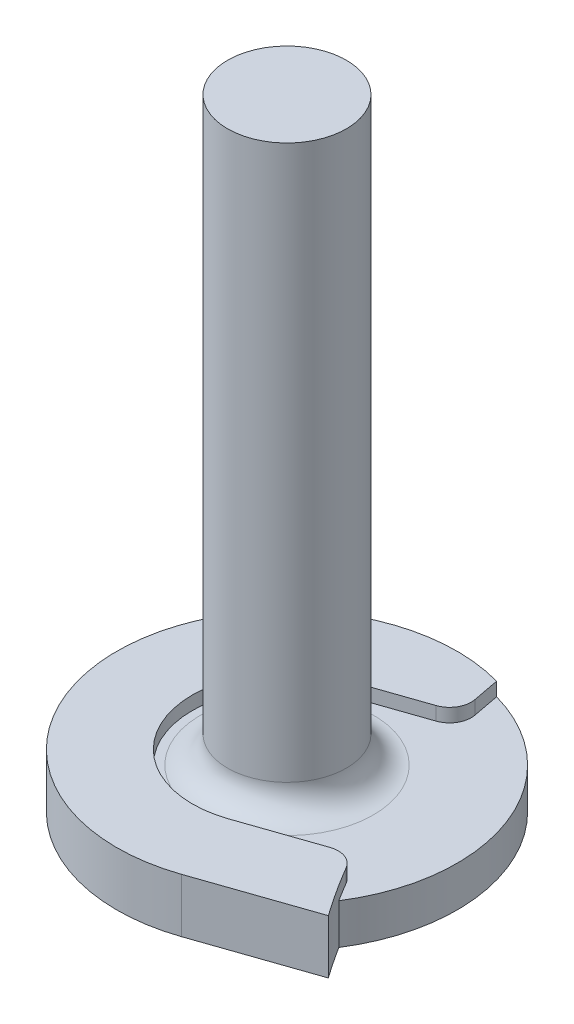
ISO-10303-21;
HEADER;
FILE_DESCRIPTION(('STEP AP214'),'2;1');
FILE_NAME('part.step','',(''),(''),'','','');
FILE_SCHEMA(('AUTOMOTIVE_DESIGN { 1 0 10303 214 1 1 1 1 }'));
ENDSEC;
DATA;
#1=APPLICATION_CONTEXT('core data for automotive mechanical design processes');
#2=APPLICATION_PROTOCOL_DEFINITION('international standard','automotive_design',2000,#1);
#3=PRODUCT_CONTEXT('',#1,'mechanical');
#4=PRODUCT('Part','Part','',(#3));
#5=PRODUCT_RELATED_PRODUCT_CATEGORY('part','',(#4));
#6=PRODUCT_DEFINITION_FORMATION('','',#4);
#7=PRODUCT_DEFINITION_CONTEXT('part definition',#1,'design');
#8=PRODUCT_DEFINITION('design','',#6,#7);
#9=PRODUCT_DEFINITION_SHAPE('','',#8);
#10=(LENGTH_UNIT() NAMED_UNIT(*) SI_UNIT(.MILLI.,.METRE.));
#11=(NAMED_UNIT(*) PLANE_ANGLE_UNIT() SI_UNIT($,.RADIAN.));
#12=(NAMED_UNIT(*) SI_UNIT($,.STERADIAN.) SOLID_ANGLE_UNIT());
#13=UNCERTAINTY_MEASURE_WITH_UNIT(LENGTH_MEASURE(1.E-05),#10,'distance_accuracy_value','');
#14=(GEOMETRIC_REPRESENTATION_CONTEXT(3) GLOBAL_UNCERTAINTY_ASSIGNED_CONTEXT((#13)) GLOBAL_UNIT_ASSIGNED_CONTEXT((#10,
#11,#12)) REPRESENTATION_CONTEXT('',''));
#15=CARTESIAN_POINT('',(0.,0.,0.));
#16=DIRECTION('',(0.,0.,1.));
#17=DIRECTION('',(1.,0.,0.));
#18=AXIS2_PLACEMENT_3D('',#15,#16,#17);
#19=CARTESIAN_POINT('',(0.,1.5,0.));
#20=DIRECTION('',(0.,1.,0.));
#21=DIRECTION('',(0.,0.,1.));
#22=AXIS2_PLACEMENT_3D('',#19,#20,#21);
#23=PLANE('',#22);
#24=CARTESIAN_POINT('',(-34.2208333619087,1.5,-108.711157920039));
#25=DIRECTION('',(0.,1.,0.));
#26=DIRECTION('',(0.,0.,1.));
#27=AXIS2_PLACEMENT_3D('',#24,#25,#26);
#28=CIRCLE('',#27,3.19999999999998);
#29=CARTESIAN_POINT('',(-34.2208333619087,1.5,-105.511157920039));
#30=VERTEX_POINT('',#29);
#31=EDGE_CURVE('E47',#30,#30,#28,.F.);
#32=ORIENTED_EDGE('',*,*,#31,.T.);
#33=EDGE_LOOP('',(#32));
#34=FACE_BOUND('',#33,.T.);
#35=CARTESIAN_POINT('',(-30.023844494459,1.5,-105.609588702521));
#36=DIRECTION('',(0.,1.,0.));
#37=DIRECTION('',(0.,0.,1.));
#38=AXIS2_PLACEMENT_3D('',#35,#36,#37);
#39=CIRCLE('',#38,0.79999999999998);
#40=CARTESIAN_POINT('',(-29.333985461818,1.5,-106.014674514521));
#41=VERTEX_POINT('',#40);
#42=CARTESIAN_POINT('',(-30.2845554448525,1.5,-106.365915219539));
#43=VERTEX_POINT('',#42);
#44=EDGE_CURVE('E174',#41,#43,#39,.T.);
#45=ORIENTED_EDGE('',*,*,#44,.F.);
#46=CARTESIAN_POINT('',(-7.04291072707894,1.5,-119.104012599587));
#47=DIRECTION('',(0.,1.,0.));
#48=DIRECTION('',(0.,0.,1.));
#49=AXIS2_PLACEMENT_3D('',#46,#47,#48);
#50=CIRCLE('',#49,25.8500054997071);
#51=CARTESIAN_POINT('',(-28.9113205849,1.5,-105.32012945204));
#52=VERTEX_POINT('',#51);
#53=EDGE_CURVE('E11',#41,#52,#50,.T.);
#54=ORIENTED_EDGE('',*,*,#53,.T.);
#55=CARTESIAN_POINT('',(-34.2208333619088,1.5,-108.711157920039));
#56=DIRECTION('',(0.,1.,0.));
#57=DIRECTION('',(0.,0.,1.));
#58=AXIS2_PLACEMENT_3D('',#55,#56,#57);
#59=CIRCLE('',#58,6.30000000000001);
#60=CARTESIAN_POINT('',(-32.5286439894425,1.5,-114.779641678583));
#61=VERTEX_POINT('',#60);
#62=EDGE_CURVE('E232',#52,#61,#59,.T.);
#63=ORIENTED_EDGE('',*,*,#62,.T.);
#64=DIRECTION('',(-0.186252011779936,0.,-0.982502004124127));
#65=VECTOR('',#64,1.);
#66=CARTESIAN_POINT('',(-32.3431122989487,1.5,-113.80093945681));
#67=LINE('',#66,#65);
#68=CARTESIAN_POINT('',(-32.3431122989487,1.5,-113.80093945681));
#69=VERTEX_POINT('',#68);
#70=EDGE_CURVE('E182',#69,#61,#67,.T.);
#71=ORIENTED_EDGE('',*,*,#70,.F.);
#72=CARTESIAN_POINT('',(-33.1260970939704,1.5,-113.636821173962));
#73=DIRECTION('',(0.,1.,0.));
#74=DIRECTION('',(0.,0.,1.));
#75=AXIS2_PLACEMENT_3D('',#72,#73,#74);
#76=CIRCLE('',#75,0.80000000000003);
#77=CARTESIAN_POINT('',(-32.8653861435768,1.5,-112.880494656944));
#78=VERTEX_POINT('',#77);
#79=EDGE_CURVE('E207',#78,#69,#76,.T.);
#80=ORIENTED_EDGE('',*,*,#79,.F.);
#81=DIRECTION('',(0.945408146272766,0.,-0.325888687991916));
#82=VECTOR('',#81,1.);
#83=CARTESIAN_POINT('',(-35.3614437698804,1.5,-112.020086431993));
#84=LINE('',#83,#82);
#85=CARTESIAN_POINT('',(-35.3614437698804,1.5,-112.020086431993));
#86=VERTEX_POINT('',#85);
#87=EDGE_CURVE('E205',#86,#78,#84,.T.);
#88=ORIENTED_EDGE('',*,*,#87,.F.);
#89=CARTESIAN_POINT('',(-34.2208333619088,1.5,-108.711157920039));
#90=DIRECTION('',(0.,-1.,0.));
#91=DIRECTION('',(0.,0.,1.));
#92=AXIS2_PLACEMENT_3D('',#89,#90,#91);
#93=CIRCLE('',#92,3.50000000000001);
#94=CARTESIAN_POINT('',(-33.080222953937,1.5,-105.402229408084));
#95=VERTEX_POINT('',#94);
#96=EDGE_CURVE('E203',#95,#86,#93,.T.);
#97=ORIENTED_EDGE('',*,*,#96,.F.);
#98=DIRECTION('',(-0.945408146272763,0.,0.325888687991926));
#99=VECTOR('',#98,1.);
#100=CARTESIAN_POINT('',(-30.2845554448525,1.5,-106.365915219539));
#101=LINE('',#100,#99);
#102=EDGE_CURVE('E201',#43,#95,#101,.T.);
#103=ORIENTED_EDGE('',*,*,#102,.F.);
#104=EDGE_LOOP('',(#45,#54,#63,#71,#80,#88,#97,#103));
#105=FACE_BOUND('',#104,.T.);
#106=ADVANCED_FACE('F39',(#34,#105),#23,.T.);
#107=CARTESIAN_POINT('',(-7.04291072707897,1.5,-119.104012599587));
#108=DIRECTION('',(0.,-1.,0.));
#109=DIRECTION('',(0.,0.,-1.));
#110=AXIS2_PLACEMENT_3D('',#107,#108,#109);
#111=CYLINDRICAL_SURFACE('',#110,25.8500054997071);
#112=CARTESIAN_POINT('',(-7.04291072707897,0.,-119.104012599587));
#113=DIRECTION('',(0.,1.,0.));
#114=DIRECTION('',(0.,0.,1.));
#115=AXIS2_PLACEMENT_3D('',#112,#113,#114);
#116=CIRCLE('',#115,25.8500054997071);
#117=CARTESIAN_POINT('',(-28.9113205849,0.,-105.32012945204));
#118=VERTEX_POINT('',#117);
#119=CARTESIAN_POINT('',(-28.1270061561455,0.,-104.147953483867));
#120=VERTEX_POINT('',#119);
#121=EDGE_CURVE('E231',#118,#120,#116,.T.);
#122=ORIENTED_EDGE('',*,*,#121,.F.);
#123=DIRECTION('',(0.,-1.,0.));
#124=VECTOR('',#123,1.);
#125=CARTESIAN_POINT('',(-28.9113205849,1.5,-105.32012945204));
#126=LINE('',#125,#124);
#127=EDGE_CURVE('E247',#52,#118,#126,.T.);
#128=ORIENTED_EDGE('',*,*,#127,.F.);
#129=ORIENTED_EDGE('',*,*,#53,.F.);
#130=DIRECTION('',(0.,-1.,0.));
#131=VECTOR('',#130,1.);
#132=CARTESIAN_POINT('',(-29.333985461818,2.,-106.014674514521));
#133=LINE('',#132,#131);
#134=CARTESIAN_POINT('',(-29.333985461818,2.,-106.014674514521));
#135=VERTEX_POINT('',#134);
#136=EDGE_CURVE('E225',#135,#41,#133,.T.);
#137=ORIENTED_EDGE('',*,*,#136,.F.);
#138=CARTESIAN_POINT('',(-7.04291072707894,2.,-119.104012599587));
#139=DIRECTION('',(0.,-1.,0.));
#140=DIRECTION('',(0.,0.,1.));
#141=AXIS2_PLACEMENT_3D('',#138,#139,#140);
#142=CIRCLE('',#141,25.8500054997071);
#143=CARTESIAN_POINT('',(-28.1270061561455,2.,-104.147953483867));
#144=VERTEX_POINT('',#143);
#145=EDGE_CURVE('E185',#144,#135,#142,.T.);
#146=ORIENTED_EDGE('',*,*,#145,.F.);
#147=DIRECTION('',(0.,-1.,0.));
#148=VECTOR('',#147,1.);
#149=CARTESIAN_POINT('',(-28.1270061561455,1.5,-104.147953483867));
#150=LINE('',#149,#148);
#151=EDGE_CURVE('E235',#144,#120,#150,.T.);
#152=ORIENTED_EDGE('',*,*,#151,.T.);
#153=EDGE_LOOP('',(#122,#128,#129,#137,#146,#152));
#154=FACE_BOUND('',#153,.T.);
#155=ADVANCED_FACE('F275',(#154),#111,.F.);
#156=CARTESIAN_POINT('',(-34.2208333619088,1.5,-108.711157920039));
#157=DIRECTION('',(0.,-1.,0.));
#158=DIRECTION('',(0.,0.,-1.));
#159=AXIS2_PLACEMENT_3D('',#156,#157,#158);
#160=CYLINDRICAL_SURFACE('',#159,6.30000000000001);
#161=CARTESIAN_POINT('',(-34.2208333619088,0.,-108.711157920039));
#162=DIRECTION('',(0.,1.,0.));
#163=DIRECTION('',(0.,0.,1.));
#164=AXIS2_PLACEMENT_3D('',#161,#162,#163);
#165=CIRCLE('',#164,6.30000000000001);
#166=CARTESIAN_POINT('',(-32.1677346275597,0.,-102.75508659852));
#167=VERTEX_POINT('',#166);
#168=EDGE_CURVE('E239',#118,#167,#165,.T.);
#169=ORIENTED_EDGE('',*,*,#168,.T.);
#170=DIRECTION('',(0.,-1.,0.));
#171=VECTOR('',#170,1.);
#172=CARTESIAN_POINT('',(-32.1677346275597,1.5,-102.75508659852));
#173=LINE('',#172,#171);
#174=CARTESIAN_POINT('',(-32.1677346275597,2.,-102.75508659852));
#175=VERTEX_POINT('',#174);
#176=EDGE_CURVE('E245',#175,#167,#173,.T.);
#177=ORIENTED_EDGE('',*,*,#176,.F.);
#178=CARTESIAN_POINT('',(-34.2208333619088,2.,-108.711157920039));
#179=DIRECTION('',(0.,1.,0.));
#180=DIRECTION('',(0.,0.,1.));
#181=AXIS2_PLACEMENT_3D('',#178,#179,#180);
#182=CIRCLE('',#181,6.3);
#183=CARTESIAN_POINT('',(-32.5286439894425,2.,-114.779641678583));
#184=VERTEX_POINT('',#183);
#185=EDGE_CURVE('E178',#184,#175,#182,.T.);
#186=ORIENTED_EDGE('',*,*,#185,.F.);
#187=DIRECTION('',(0.,-1.,0.));
#188=VECTOR('',#187,1.);
#189=CARTESIAN_POINT('',(-32.5286439894425,2.,-114.779641678583));
#190=LINE('',#189,#188);
#191=EDGE_CURVE('E199',#184,#61,#190,.T.);
#192=ORIENTED_EDGE('',*,*,#191,.T.);
#193=ORIENTED_EDGE('',*,*,#62,.F.);
#194=ORIENTED_EDGE('',*,*,#127,.T.);
#195=EDGE_LOOP('',(#169,#177,#186,#192,#193,#194));
#196=FACE_BOUND('',#195,.T.);
#197=ADVANCED_FACE('F279',(#196),#160,.T.);
#198=CARTESIAN_POINT('',(-35.0749421933048,1.5,-101.752952162662));
#199=DIRECTION('',(0.325888687991939,0.,0.945408146272758));
#200=DIRECTION('',(0.945408146272758,0.,-0.325888687991939));
#201=AXIS2_PLACEMENT_3D('',#198,#199,#200);
#202=PLANE('',#201);
#203=DIRECTION('',(-0.945408146272758,0.,0.325888687991939));
#204=VECTOR('',#203,1.);
#205=CARTESIAN_POINT('',(-35.0749421933048,0.,-101.752952162662));
#206=LINE('',#205,#204);
#207=EDGE_CURVE('E236',#120,#167,#206,.T.);
#208=ORIENTED_EDGE('',*,*,#207,.F.);
#209=ORIENTED_EDGE('',*,*,#151,.F.);
#210=DIRECTION('',(0.945408146272758,0.,-0.325888687991939));
#211=VECTOR('',#210,1.);
#212=CARTESIAN_POINT('',(-28.1270061561455,2.,-104.147953483867));
#213=LINE('',#212,#211);
#214=EDGE_CURVE('E181',#175,#144,#213,.T.);
#215=ORIENTED_EDGE('',*,*,#214,.F.);
#216=ORIENTED_EDGE('',*,*,#176,.T.);
#217=EDGE_LOOP('',(#208,#209,#215,#216));
#218=FACE_BOUND('',#217,.T.);
#219=ADVANCED_FACE('F284',(#218),#202,.T.);
#220=CARTESIAN_POINT('',(0.,0.,0.));
#221=DIRECTION('',(0.,1.,0.));
#222=DIRECTION('',(0.,0.,1.));
#223=AXIS2_PLACEMENT_3D('',#220,#221,#222);
#224=PLANE('',#223);
#225=DIRECTION('',(0.,0.,1.));
#226=VECTOR('',#225,1.);
#227=CARTESIAN_POINT('',(-31.7208333619088,0.,-111.211157920039));
#228=LINE('',#227,#226);
#229=CARTESIAN_POINT('',(-31.7208333619088,0.,-111.211157920039));
#230=VERTEX_POINT('',#229);
#231=CARTESIAN_POINT('',(-31.7208333619088,0.,-106.211157920039));
#232=VERTEX_POINT('',#231);
#233=EDGE_CURVE('E168',#230,#232,#228,.T.);
#234=ORIENTED_EDGE('',*,*,#233,.F.);
#235=DIRECTION('',(1.,0.,0.));
#236=VECTOR('',#235,1.);
#237=CARTESIAN_POINT('',(-36.7208333619088,0.,-111.211157920039));
#238=LINE('',#237,#236);
#239=CARTESIAN_POINT('',(-36.7208333619088,0.,-111.211157920039));
#240=VERTEX_POINT('',#239);
#241=EDGE_CURVE('E54',#240,#230,#238,.T.);
#242=ORIENTED_EDGE('',*,*,#241,.F.);
#243=DIRECTION('',(0.,0.,1.));
#244=VECTOR('',#243,1.);
#245=CARTESIAN_POINT('',(-36.7208333619088,0.,-111.211157920039));
#246=LINE('',#245,#244);
#247=CARTESIAN_POINT('',(-36.7208333619088,0.,-106.211157920039));
#248=VERTEX_POINT('',#247);
#249=EDGE_CURVE('E159',#240,#248,#246,.T.);
#250=ORIENTED_EDGE('',*,*,#249,.T.);
#251=DIRECTION('',(1.,0.,0.));
#252=VECTOR('',#251,1.);
#253=CARTESIAN_POINT('',(-36.7208333619088,0.,-106.211157920039));
#254=LINE('',#253,#252);
#255=EDGE_CURVE('E162',#248,#232,#254,.T.);
#256=ORIENTED_EDGE('',*,*,#255,.T.);
#257=EDGE_LOOP('',(#234,#242,#250,#256));
#258=FACE_BOUND('',#257,.T.);
#259=ORIENTED_EDGE('',*,*,#121,.T.);
#260=ORIENTED_EDGE('',*,*,#207,.T.);
#261=ORIENTED_EDGE('',*,*,#168,.F.);
#262=EDGE_LOOP('',(#259,#260,#261));
#263=FACE_BOUND('',#262,.T.);
#264=ADVANCED_FACE('F265',(#258,#263),#224,.F.);
#265=CARTESIAN_POINT('',(-34.2208333619087,29.2225396786903,-108.711157920039));
#266=DIRECTION('',(0.,-1.,0.));
#267=DIRECTION('',(0.,0.,-1.));
#268=AXIS2_PLACEMENT_3D('',#265,#266,#267);
#269=CYLINDRICAL_SURFACE('',#268,2.19999999999998);
#270=CARTESIAN_POINT('',(-34.2208333619087,2.5,-108.711157920039));
#271=DIRECTION('',(0.,1.,0.));
#272=DIRECTION('',(0.,0.,1.));
#273=AXIS2_PLACEMENT_3D('',#270,#271,#272);
#274=CIRCLE('',#273,2.19999999999998);
#275=CARTESIAN_POINT('',(-34.2208333619087,2.5,-106.511157920039));
#276=VERTEX_POINT('',#275);
#277=EDGE_CURVE('E249',#276,#276,#274,.T.);
#278=ORIENTED_EDGE('',*,*,#277,.T.);
#279=EDGE_LOOP('',(#278));
#280=FACE_BOUND('',#279,.T.);
#281=CARTESIAN_POINT('',(-34.2208333619087,23.0000000042488,-108.711157920039));
#282=DIRECTION('',(0.,1.,0.));
#283=DIRECTION('',(0.,0.,1.));
#284=AXIS2_PLACEMENT_3D('',#281,#282,#283);
#285=CIRCLE('',#284,2.19999999999998);
#286=CARTESIAN_POINT('',(-34.2208333619087,23.0000000042488,-106.511157920039));
#287=VERTEX_POINT('',#286);
#288=EDGE_CURVE('E228',#287,#287,#285,.T.);
#289=ORIENTED_EDGE('',*,*,#288,.F.);
#290=EDGE_LOOP('',(#289));
#291=FACE_BOUND('',#290,.T.);
#292=ADVANCED_FACE('F262',(#280,#291),#269,.T.);
#293=CARTESIAN_POINT('',(-36.103123007897,23.0000000042488,-73.9437006253321));
#294=DIRECTION('',(0.,1.,0.));
#295=DIRECTION('',(0.924224592736292,0.,0.381849318686619));
#296=AXIS2_PLACEMENT_3D('',#293,#294,#295);
#297=PLANE('',#296);
#298=ORIENTED_EDGE('',*,*,#288,.T.);
#299=EDGE_LOOP('',(#298));
#300=FACE_BOUND('',#299,.T.);
#301=ADVANCED_FACE('F259',(#300),#297,.T.);
#302=CARTESIAN_POINT('',(-34.2208333619087,2.5,-108.711157920039));
#303=DIRECTION('',(0.,1.,0.));
#304=DIRECTION('',(0.,0.,1.));
#305=AXIS2_PLACEMENT_3D('',#302,#303,#304);
#306=TOROIDAL_SURFACE('',#305,3.19999999999998,1.);
#307=ORIENTED_EDGE('',*,*,#31,.F.);
#308=EDGE_LOOP('',(#307));
#309=FACE_BOUND('',#308,.T.);
#310=ORIENTED_EDGE('',*,*,#277,.F.);
#311=EDGE_LOOP('',(#310));
#312=FACE_BOUND('',#311,.T.);
#313=ADVANCED_FACE('F41',(#309,#312),#306,.F.);
#314=CARTESIAN_POINT('',(-30.023844494459,2.,-105.609588702521));
#315=DIRECTION('',(0.,-1.,0.));
#316=DIRECTION('',(0.,0.,-1.));
#317=AXIS2_PLACEMENT_3D('',#314,#315,#316);
#318=CYLINDRICAL_SURFACE('',#317,0.79999999999998);
#319=ORIENTED_EDGE('',*,*,#44,.T.);
#320=DIRECTION('',(0.,-1.,0.));
#321=VECTOR('',#320,1.);
#322=CARTESIAN_POINT('',(-30.2845554448525,2.,-106.365915219539));
#323=LINE('',#322,#321);
#324=CARTESIAN_POINT('',(-30.2845554448525,2.,-106.365915219539));
#325=VERTEX_POINT('',#324);
#326=EDGE_CURVE('E222',#325,#43,#323,.T.);
#327=ORIENTED_EDGE('',*,*,#326,.F.);
#328=CARTESIAN_POINT('',(-30.023844494459,2.,-105.609588702521));
#329=DIRECTION('',(0.,1.,0.));
#330=DIRECTION('',(0.,0.,1.));
#331=AXIS2_PLACEMENT_3D('',#328,#329,#330);
#332=CIRCLE('',#331,0.79999999999998);
#333=EDGE_CURVE('E187',#135,#325,#332,.T.);
#334=ORIENTED_EDGE('',*,*,#333,.F.);
#335=ORIENTED_EDGE('',*,*,#136,.T.);
#336=EDGE_LOOP('',(#319,#327,#334,#335));
#337=FACE_BOUND('',#336,.T.);
#338=ADVANCED_FACE('F258',(#337),#318,.T.);
#339=CARTESIAN_POINT('',(-30.2845554448525,2.,-106.365915219539));
#340=DIRECTION('',(0.325888687991926,0.,0.945408146272763));
#341=DIRECTION('',(0.945408146272763,0.,-0.325888687991926));
#342=AXIS2_PLACEMENT_3D('',#339,#340,#341);
#343=PLANE('',#342);
#344=ORIENTED_EDGE('',*,*,#102,.T.);
#345=DIRECTION('',(0.,-1.,0.));
#346=VECTOR('',#345,1.);
#347=CARTESIAN_POINT('',(-33.080222953937,2.,-105.402229408084));
#348=LINE('',#347,#346);
#349=CARTESIAN_POINT('',(-33.080222953937,2.,-105.402229408084));
#350=VERTEX_POINT('',#349);
#351=EDGE_CURVE('E219',#350,#95,#348,.T.);
#352=ORIENTED_EDGE('',*,*,#351,.F.);
#353=DIRECTION('',(-0.945408146272763,0.,0.325888687991926));
#354=VECTOR('',#353,1.);
#355=CARTESIAN_POINT('',(-30.2845554448525,2.,-106.365915219539));
#356=LINE('',#355,#354);
#357=EDGE_CURVE('E189',#325,#350,#356,.T.);
#358=ORIENTED_EDGE('',*,*,#357,.F.);
#359=ORIENTED_EDGE('',*,*,#326,.T.);
#360=EDGE_LOOP('',(#344,#352,#358,#359));
#361=FACE_BOUND('',#360,.T.);
#362=ADVANCED_FACE('F316',(#361),#343,.F.);
#363=CARTESIAN_POINT('',(-34.2208333619088,2.,-108.711157920039));
#364=DIRECTION('',(0.,-1.,0.));
#365=DIRECTION('',(0.,0.,-1.));
#366=AXIS2_PLACEMENT_3D('',#363,#364,#365);
#367=CYLINDRICAL_SURFACE('',#366,3.50000000000001);
#368=ORIENTED_EDGE('',*,*,#96,.T.);
#369=DIRECTION('',(0.,-1.,0.));
#370=VECTOR('',#369,1.);
#371=CARTESIAN_POINT('',(-35.3614437698804,2.,-112.020086431993));
#372=LINE('',#371,#370);
#373=CARTESIAN_POINT('',(-35.3614437698804,2.,-112.020086431993));
#374=VERTEX_POINT('',#373);
#375=EDGE_CURVE('E216',#374,#86,#372,.T.);
#376=ORIENTED_EDGE('',*,*,#375,.F.);
#377=CARTESIAN_POINT('',(-34.2208333619088,2.,-108.711157920039));
#378=DIRECTION('',(0.,-1.,0.));
#379=DIRECTION('',(0.,0.,1.));
#380=AXIS2_PLACEMENT_3D('',#377,#378,#379);
#381=CIRCLE('',#380,3.50000000000001);
#382=EDGE_CURVE('E191',#350,#374,#381,.T.);
#383=ORIENTED_EDGE('',*,*,#382,.F.);
#384=ORIENTED_EDGE('',*,*,#351,.T.);
#385=EDGE_LOOP('',(#368,#376,#383,#384));
#386=FACE_BOUND('',#385,.T.);
#387=ADVANCED_FACE('F321',(#386),#367,.F.);
#388=CARTESIAN_POINT('',(-35.3614437698804,2.,-112.020086431993));
#389=DIRECTION('',(-0.325888687991916,0.,-0.945408146272766));
#390=DIRECTION('',(-0.945408146272766,0.,0.325888687991916));
#391=AXIS2_PLACEMENT_3D('',#388,#389,#390);
#392=PLANE('',#391);
#393=ORIENTED_EDGE('',*,*,#87,.T.);
#394=DIRECTION('',(0.,-1.,0.));
#395=VECTOR('',#394,1.);
#396=CARTESIAN_POINT('',(-32.8653861435768,2.,-112.880494656944));
#397=LINE('',#396,#395);
#398=CARTESIAN_POINT('',(-32.8653861435768,2.,-112.880494656944));
#399=VERTEX_POINT('',#398);
#400=EDGE_CURVE('E213',#399,#78,#397,.T.);
#401=ORIENTED_EDGE('',*,*,#400,.F.);
#402=DIRECTION('',(0.945408146272766,0.,-0.325888687991916));
#403=VECTOR('',#402,1.);
#404=CARTESIAN_POINT('',(-35.3614437698804,2.,-112.020086431993));
#405=LINE('',#404,#403);
#406=EDGE_CURVE('E193',#374,#399,#405,.T.);
#407=ORIENTED_EDGE('',*,*,#406,.F.);
#408=ORIENTED_EDGE('',*,*,#375,.T.);
#409=EDGE_LOOP('',(#393,#401,#407,#408));
#410=FACE_BOUND('',#409,.T.);
#411=ADVANCED_FACE('F326',(#410),#392,.F.);
#412=CARTESIAN_POINT('',(-33.1260970939704,2.,-113.636821173962));
#413=DIRECTION('',(0.,-1.,0.));
#414=DIRECTION('',(0.,0.,-1.));
#415=AXIS2_PLACEMENT_3D('',#412,#413,#414);
#416=CYLINDRICAL_SURFACE('',#415,0.80000000000003);
#417=ORIENTED_EDGE('',*,*,#79,.T.);
#418=DIRECTION('',(0.,-1.,0.));
#419=VECTOR('',#418,1.);
#420=CARTESIAN_POINT('',(-32.3431122989487,2.,-113.80093945681));
#421=LINE('',#420,#419);
#422=CARTESIAN_POINT('',(-32.3431122989487,2.,-113.80093945681));
#423=VERTEX_POINT('',#422);
#424=EDGE_CURVE('E62',#423,#69,#421,.T.);
#425=ORIENTED_EDGE('',*,*,#424,.F.);
#426=CARTESIAN_POINT('',(-33.1260970939704,2.,-113.636821173962));
#427=DIRECTION('',(0.,1.,0.));
#428=DIRECTION('',(0.,0.,1.));
#429=AXIS2_PLACEMENT_3D('',#426,#427,#428);
#430=CIRCLE('',#429,0.80000000000003);
#431=EDGE_CURVE('E195',#399,#423,#430,.T.);
#432=ORIENTED_EDGE('',*,*,#431,.F.);
#433=ORIENTED_EDGE('',*,*,#400,.T.);
#434=EDGE_LOOP('',(#417,#425,#432,#433));
#435=FACE_BOUND('',#434,.T.);
#436=ADVANCED_FACE('F329',(#435),#416,.T.);
#437=CARTESIAN_POINT('',(-32.3431122989487,2.,-113.80093945681));
#438=DIRECTION('',(-0.982502004124127,0.,0.186252011779936));
#439=DIRECTION('',(0.186252011779936,0.,0.982502004124127));
#440=AXIS2_PLACEMENT_3D('',#437,#438,#439);
#441=PLANE('',#440);
#442=ORIENTED_EDGE('',*,*,#70,.T.);
#443=ORIENTED_EDGE('',*,*,#191,.F.);
#444=DIRECTION('',(-0.186252011779936,0.,-0.982502004124127));
#445=VECTOR('',#444,1.);
#446=CARTESIAN_POINT('',(-32.3431122989487,2.,-113.80093945681));
#447=LINE('',#446,#445);
#448=EDGE_CURVE('E197',#423,#184,#447,.T.);
#449=ORIENTED_EDGE('',*,*,#448,.F.);
#450=ORIENTED_EDGE('',*,*,#424,.T.);
#451=EDGE_LOOP('',(#442,#443,#449,#450));
#452=FACE_BOUND('',#451,.T.);
#453=ADVANCED_FACE('F330',(#452),#441,.F.);
#454=CARTESIAN_POINT('',(-34.2208333619088,2.,-108.711157920039));
#455=DIRECTION('',(0.,1.,0.));
#456=DIRECTION('',(0.,0.,1.));
#457=AXIS2_PLACEMENT_3D('',#454,#455,#456);
#458=PLANE('',#457);
#459=ORIENTED_EDGE('',*,*,#185,.T.);
#460=ORIENTED_EDGE('',*,*,#214,.T.);
#461=ORIENTED_EDGE('',*,*,#145,.T.);
#462=ORIENTED_EDGE('',*,*,#333,.T.);
#463=ORIENTED_EDGE('',*,*,#357,.T.);
#464=ORIENTED_EDGE('',*,*,#382,.T.);
#465=ORIENTED_EDGE('',*,*,#406,.T.);
#466=ORIENTED_EDGE('',*,*,#431,.T.);
#467=ORIENTED_EDGE('',*,*,#448,.T.);
#468=EDGE_LOOP('',(#459,#460,#461,#462,#463,#464,#465,#466,#467));
#469=FACE_BOUND('',#468,.T.);
#470=ADVANCED_FACE('F303',(#469),#458,.T.);
#471=CARTESIAN_POINT('',(-36.7208333619088,0.5,-111.211157920039));
#472=DIRECTION('',(0.,0.,-1.));
#473=DIRECTION('',(-1.,0.,0.));
#474=AXIS2_PLACEMENT_3D('',#471,#472,#473);
#475=PLANE('',#474);
#476=ORIENTED_EDGE('',*,*,#241,.T.);
#477=DIRECTION('',(0.,-1.,0.));
#478=VECTOR('',#477,1.);
#479=CARTESIAN_POINT('',(-31.7208333619088,0.5,-111.211157920039));
#480=LINE('',#479,#478);
#481=CARTESIAN_POINT('',(-31.7208333619088,0.5,-111.211157920039));
#482=VERTEX_POINT('',#481);
#483=EDGE_CURVE('E138',#482,#230,#480,.T.);
#484=ORIENTED_EDGE('',*,*,#483,.F.);
#485=DIRECTION('',(1.,0.,0.));
#486=VECTOR('',#485,1.);
#487=CARTESIAN_POINT('',(-36.7208333619088,0.5,-111.211157920039));
#488=LINE('',#487,#486);
#489=CARTESIAN_POINT('',(-36.7208333619088,0.5,-111.211157920039));
#490=VERTEX_POINT('',#489);
#491=EDGE_CURVE('E142',#490,#482,#488,.T.);
#492=ORIENTED_EDGE('',*,*,#491,.F.);
#493=DIRECTION('',(0.,-1.,0.));
#494=VECTOR('',#493,1.);
#495=CARTESIAN_POINT('',(-36.7208333619088,0.5,-111.211157920039));
#496=LINE('',#495,#494);
#497=EDGE_CURVE('E172',#490,#240,#496,.T.);
#498=ORIENTED_EDGE('',*,*,#497,.T.);
#499=EDGE_LOOP('',(#476,#484,#492,#498));
#500=FACE_BOUND('',#499,.T.);
#501=ADVANCED_FACE('F140',(#500),#475,.F.);
#502=CARTESIAN_POINT('',(-36.7208333619088,0.5,-111.211157920039));
#503=DIRECTION('',(1.,0.,0.));
#504=DIRECTION('',(0.,0.,-1.));
#505=AXIS2_PLACEMENT_3D('',#502,#503,#504);
#506=PLANE('',#505);
#507=ORIENTED_EDGE('',*,*,#249,.F.);
#508=ORIENTED_EDGE('',*,*,#497,.F.);
#509=DIRECTION('',(0.,0.,1.));
#510=VECTOR('',#509,1.);
#511=CARTESIAN_POINT('',(-36.7208333619088,0.5,-111.211157920039));
#512=LINE('',#511,#510);
#513=CARTESIAN_POINT('',(-36.7208333619088,0.5,-106.211157920039));
#514=VERTEX_POINT('',#513);
#515=EDGE_CURVE('E147',#490,#514,#512,.T.);
#516=ORIENTED_EDGE('',*,*,#515,.T.);
#517=DIRECTION('',(0.,-1.,0.));
#518=VECTOR('',#517,1.);
#519=CARTESIAN_POINT('',(-36.7208333619088,0.5,-106.211157920039));
#520=LINE('',#519,#518);
#521=EDGE_CURVE('E175',#514,#248,#520,.T.);
#522=ORIENTED_EDGE('',*,*,#521,.T.);
#523=EDGE_LOOP('',(#507,#508,#516,#522));
#524=FACE_BOUND('',#523,.T.);
#525=ADVANCED_FACE('F400',(#524),#506,.T.);
#526=CARTESIAN_POINT('',(-36.7208333619088,0.5,-106.211157920039));
#527=DIRECTION('',(0.,0.,-1.));
#528=DIRECTION('',(-1.,0.,0.));
#529=AXIS2_PLACEMENT_3D('',#526,#527,#528);
#530=PLANE('',#529);
#531=ORIENTED_EDGE('',*,*,#255,.F.);
#532=ORIENTED_EDGE('',*,*,#521,.F.);
#533=DIRECTION('',(1.,0.,0.));
#534=VECTOR('',#533,1.);
#535=CARTESIAN_POINT('',(-36.7208333619088,0.5,-106.211157920039));
#536=LINE('',#535,#534);
#537=CARTESIAN_POINT('',(-31.7208333619088,0.5,-106.211157920039));
#538=VERTEX_POINT('',#537);
#539=EDGE_CURVE('E155',#514,#538,#536,.T.);
#540=ORIENTED_EDGE('',*,*,#539,.T.);
#541=DIRECTION('',(0.,-1.,0.));
#542=VECTOR('',#541,1.);
#543=CARTESIAN_POINT('',(-31.7208333619088,0.5,-106.211157920039));
#544=LINE('',#543,#542);
#545=EDGE_CURVE('E146',#538,#232,#544,.T.);
#546=ORIENTED_EDGE('',*,*,#545,.T.);
#547=EDGE_LOOP('',(#531,#532,#540,#546));
#548=FACE_BOUND('',#547,.T.);
#549=ADVANCED_FACE('F409',(#548),#530,.T.);
#550=CARTESIAN_POINT('',(-31.7208333619088,0.5,-111.211157920039));
#551=DIRECTION('',(1.,0.,0.));
#552=DIRECTION('',(0.,0.,-1.));
#553=AXIS2_PLACEMENT_3D('',#550,#551,#552);
#554=PLANE('',#553);
#555=ORIENTED_EDGE('',*,*,#233,.T.);
#556=ORIENTED_EDGE('',*,*,#545,.F.);
#557=DIRECTION('',(0.,0.,1.));
#558=VECTOR('',#557,1.);
#559=CARTESIAN_POINT('',(-31.7208333619088,0.5,-111.211157920039));
#560=LINE('',#559,#558);
#561=EDGE_CURVE('E151',#482,#538,#560,.T.);
#562=ORIENTED_EDGE('',*,*,#561,.F.);
#563=ORIENTED_EDGE('',*,*,#483,.T.);
#564=EDGE_LOOP('',(#555,#556,#562,#563));
#565=FACE_BOUND('',#564,.T.);
#566=ADVANCED_FACE('F152',(#565),#554,.F.);
#567=CARTESIAN_POINT('',(0.,0.5,0.));
#568=DIRECTION('',(0.,-1.,0.));
#569=DIRECTION('',(0.,0.,-1.));
#570=AXIS2_PLACEMENT_3D('',#567,#568,#569);
#571=PLANE('',#570);
#572=ORIENTED_EDGE('',*,*,#491,.T.);
#573=ORIENTED_EDGE('',*,*,#561,.T.);
#574=ORIENTED_EDGE('',*,*,#539,.F.);
#575=ORIENTED_EDGE('',*,*,#515,.F.);
#576=EDGE_LOOP('',(#572,#573,#574,#575));
#577=FACE_BOUND('',#576,.T.);
#578=ADVANCED_FACE('F158',(#577),#571,.T.);
#579=CLOSED_SHELL('',(#106,#155,#197,#219,#264,#292,#301,#313,#338,#362,#387,#411,#436,#453,
#470,#501,#525,#549,#566,#578));
#580=MANIFOLD_SOLID_BREP('B2',#579);
#581=ADVANCED_BREP_SHAPE_REPRESENTATION('',(#18,#580),#14);
#582=SHAPE_DEFINITION_REPRESENTATION(#9,#581);
ENDSEC;
END-ISO-10303-21;
